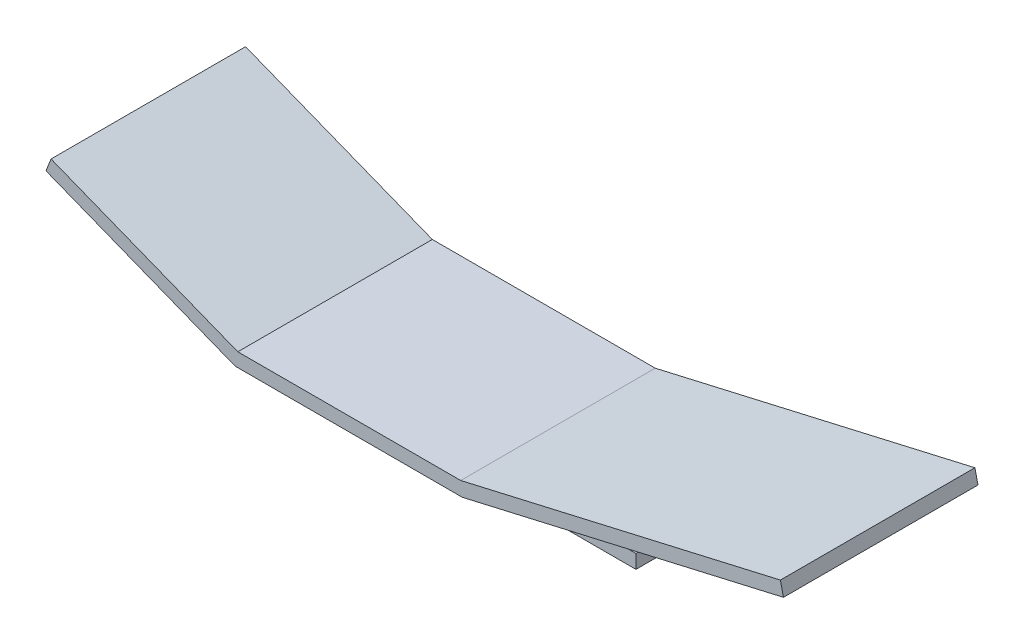
ISO-10303-21;
HEADER;
FILE_DESCRIPTION(('STEP AP214'),'2;1');
FILE_NAME('part.step','',(''),(''),'','','');
FILE_SCHEMA(('AUTOMOTIVE_DESIGN { 1 0 10303 214 1 1 1 1 }'));
ENDSEC;
DATA;
#1=APPLICATION_CONTEXT('core data for automotive mechanical design processes');
#2=APPLICATION_PROTOCOL_DEFINITION('international standard','automotive_design',2000,#1);
#3=PRODUCT_CONTEXT('',#1,'mechanical');
#4=PRODUCT('Part','Part','',(#3));
#5=PRODUCT_RELATED_PRODUCT_CATEGORY('part','',(#4));
#6=PRODUCT_DEFINITION_FORMATION('','',#4);
#7=PRODUCT_DEFINITION_CONTEXT('part definition',#1,'design');
#8=PRODUCT_DEFINITION('design','',#6,#7);
#9=PRODUCT_DEFINITION_SHAPE('','',#8);
#10=(LENGTH_UNIT() NAMED_UNIT(*) SI_UNIT(.MILLI.,.METRE.));
#11=(NAMED_UNIT(*) PLANE_ANGLE_UNIT() SI_UNIT($,.RADIAN.));
#12=(NAMED_UNIT(*) SI_UNIT($,.STERADIAN.) SOLID_ANGLE_UNIT());
#13=UNCERTAINTY_MEASURE_WITH_UNIT(LENGTH_MEASURE(1.E-05),#10,'distance_accuracy_value','');
#14=(GEOMETRIC_REPRESENTATION_CONTEXT(3) GLOBAL_UNCERTAINTY_ASSIGNED_CONTEXT((#13)) GLOBAL_UNIT_ASSIGNED_CONTEXT((#10,
#11,#12)) REPRESENTATION_CONTEXT('',''));
#15=CARTESIAN_POINT('',(0.,0.,0.));
#16=DIRECTION('',(0.,0.,1.));
#17=DIRECTION('',(1.,0.,0.));
#18=AXIS2_PLACEMENT_3D('',#15,#16,#17);
#19=CARTESIAN_POINT('',(-6.23340511781482,956.424051105642,270.));
#20=DIRECTION('',(0.930350718252127,-0.366670889283225,0.));
#21=DIRECTION('',(0.366670889283225,0.930350718252127,0.));
#22=AXIS2_PLACEMENT_3D('',#19,#20,#21);
#23=PLANE('',#22);
#24=DIRECTION('',(-0.366670889283225,-0.930350718252127,0.));
#25=VECTOR('',#24,1.);
#26=CARTESIAN_POINT('',(-6.23340511781482,956.424051105642,30.));
#27=LINE('',#26,#25);
#28=CARTESIAN_POINT('',(0.,972.240013315928,30.));
#29=VERTEX_POINT('',#28);
#30=CARTESIAN_POINT('',(-6.23340511781482,956.424051105642,30.));
#31=VERTEX_POINT('',#30);
#32=EDGE_CURVE('E139',#29,#31,#27,.T.);
#33=ORIENTED_EDGE('',*,*,#32,.T.);
#34=DIRECTION('',(0.,0.,-1.));
#35=VECTOR('',#34,1.);
#36=CARTESIAN_POINT('',(-6.23340511781482,956.424051105642,270.));
#37=LINE('',#36,#35);
#38=CARTESIAN_POINT('',(-6.23340511781482,956.424051105642,270.));
#39=VERTEX_POINT('',#38);
#40=EDGE_CURVE('E12',#39,#31,#37,.T.);
#41=ORIENTED_EDGE('',*,*,#40,.F.);
#42=DIRECTION('',(-0.366670889283225,-0.930350718252127,0.));
#43=VECTOR('',#42,1.);
#44=CARTESIAN_POINT('',(-6.23340511781482,956.424051105642,270.));
#45=LINE('',#44,#43);
#46=CARTESIAN_POINT('',(0.,972.240013315928,270.));
#47=VERTEX_POINT('',#46);
#48=EDGE_CURVE('E153',#47,#39,#45,.T.);
#49=ORIENTED_EDGE('',*,*,#48,.F.);
#50=DIRECTION('',(0.,0.,-1.));
#51=VECTOR('',#50,1.);
#52=CARTESIAN_POINT('',(0.,972.240013315928,270.));
#53=LINE('',#52,#51);
#54=EDGE_CURVE('E135',#47,#29,#53,.T.);
#55=ORIENTED_EDGE('',*,*,#54,.T.);
#56=EDGE_LOOP('',(#33,#41,#49,#55));
#57=FACE_BOUND('',#56,.T.);
#58=ADVANCED_FACE('F43',(#57),#23,.F.);
#59=CARTESIAN_POINT('',(-6.23340511781482,956.424051105642,270.));
#60=DIRECTION('',(0.366670889283225,0.930350718252127,0.));
#61=DIRECTION('',(-0.930350718252127,0.366670889283225,0.));
#62=AXIS2_PLACEMENT_3D('',#59,#60,#61);
#63=PLANE('',#62);
#64=DIRECTION('',(0.930350718252127,-0.366670889283225,0.));
#65=VECTOR('',#64,1.);
#66=CARTESIAN_POINT('',(-6.23340511781482,956.424051105642,30.));
#67=LINE('',#66,#65);
#68=CARTESIAN_POINT('',(227.172021002602,864.434037576239,30.));
#69=VERTEX_POINT('',#68);
#70=EDGE_CURVE('E142',#31,#69,#67,.T.);
#71=ORIENTED_EDGE('',*,*,#70,.T.);
#72=DIRECTION('',(0.,0.,-1.));
#73=VECTOR('',#72,1.);
#74=CARTESIAN_POINT('',(227.172021002602,864.434037576239,270.));
#75=LINE('',#74,#73);
#76=CARTESIAN_POINT('',(227.172021002602,864.434037576239,270.));
#77=VERTEX_POINT('',#76);
#78=EDGE_CURVE('E51',#77,#69,#75,.T.);
#79=ORIENTED_EDGE('',*,*,#78,.F.);
#80=DIRECTION('',(0.930350718252127,-0.366670889283225,0.));
#81=VECTOR('',#80,1.);
#82=CARTESIAN_POINT('',(-6.23340511781482,956.424051105642,270.));
#83=LINE('',#82,#81);
#84=EDGE_CURVE('E102',#39,#77,#83,.T.);
#85=ORIENTED_EDGE('',*,*,#84,.F.);
#86=ORIENTED_EDGE('',*,*,#40,.T.);
#87=EDGE_LOOP('',(#71,#79,#85,#86));
#88=FACE_BOUND('',#87,.T.);
#89=ADVANCED_FACE('F188',(#88),#63,.F.);
#90=CARTESIAN_POINT('',(227.172021002602,864.434037576239,270.));
#91=DIRECTION('',(0.,1.,0.));
#92=DIRECTION('',(0.,0.,1.));
#93=AXIS2_PLACEMENT_3D('',#90,#91,#92);
#94=PLANE('',#93);
#95=DIRECTION('',(1.,0.,0.));
#96=VECTOR('',#95,1.);
#97=CARTESIAN_POINT('',(227.172021002602,864.434037576239,30.));
#98=LINE('',#97,#96);
#99=CARTESIAN_POINT('',(507.332852152899,864.434037576239,30.));
#100=VERTEX_POINT('',#99);
#101=EDGE_CURVE('E144',#69,#100,#98,.T.);
#102=ORIENTED_EDGE('',*,*,#101,.T.);
#103=DIRECTION('',(0.,0.,-1.));
#104=VECTOR('',#103,1.);
#105=CARTESIAN_POINT('',(507.332852152899,864.434037576239,270.));
#106=LINE('',#105,#104);
#107=CARTESIAN_POINT('',(507.332852152899,864.434037576239,270.));
#108=VERTEX_POINT('',#107);
#109=EDGE_CURVE('E160',#108,#100,#106,.T.);
#110=ORIENTED_EDGE('',*,*,#109,.F.);
#111=DIRECTION('',(1.,0.,0.));
#112=VECTOR('',#111,1.);
#113=CARTESIAN_POINT('',(227.172021002602,864.434037576239,270.));
#114=LINE('',#113,#112);
#115=EDGE_CURVE('E168',#77,#108,#114,.T.);
#116=ORIENTED_EDGE('',*,*,#115,.F.);
#117=ORIENTED_EDGE('',*,*,#78,.T.);
#118=EDGE_LOOP('',(#102,#110,#116,#117));
#119=FACE_BOUND('',#118,.T.);
#120=ADVANCED_FACE('F166',(#119),#94,.F.);
#121=CARTESIAN_POINT('',(507.332852152899,864.434037576239,270.));
#122=DIRECTION('',(-0.224359040766347,0.974506552479974,0.));
#123=DIRECTION('',(-0.974506552479974,-0.224359040766347,0.));
#124=AXIS2_PLACEMENT_3D('',#121,#122,#123);
#125=PLANE('',#124);
#126=DIRECTION('',(0.974506552479974,0.224359040766347,0.));
#127=VECTOR('',#126,1.);
#128=CARTESIAN_POINT('',(507.332852152899,864.434037576239,30.));
#129=LINE('',#128,#127);
#130=CARTESIAN_POINT('',(903.632275153964,955.673401923769,30.));
#131=VERTEX_POINT('',#130);
#132=EDGE_CURVE('E146',#100,#131,#129,.T.);
#133=ORIENTED_EDGE('',*,*,#132,.T.);
#134=DIRECTION('',(0.,0.,-1.));
#135=VECTOR('',#134,1.);
#136=CARTESIAN_POINT('',(903.632275153964,955.673401923769,270.));
#137=LINE('',#136,#135);
#138=CARTESIAN_POINT('',(903.632275153964,955.673401923769,270.));
#139=VERTEX_POINT('',#138);
#140=EDGE_CURVE('E157',#139,#131,#137,.T.);
#141=ORIENTED_EDGE('',*,*,#140,.F.);
#142=DIRECTION('',(0.974506552479974,0.224359040766347,0.));
#143=VECTOR('',#142,1.);
#144=CARTESIAN_POINT('',(507.332852152899,864.434037576239,270.));
#145=LINE('',#144,#143);
#146=EDGE_CURVE('E180',#108,#139,#145,.T.);
#147=ORIENTED_EDGE('',*,*,#146,.F.);
#148=ORIENTED_EDGE('',*,*,#109,.T.);
#149=EDGE_LOOP('',(#133,#141,#147,#148));
#150=FACE_BOUND('',#149,.T.);
#151=ADVANCED_FACE('F176',(#150),#125,.F.);
#152=CARTESIAN_POINT('',(903.632275153964,955.673401923769,270.));
#153=DIRECTION('',(-0.974506552479972,-0.224359040766355,0.));
#154=DIRECTION('',(0.224359040766355,-0.974506552479973,0.));
#155=AXIS2_PLACEMENT_3D('',#152,#153,#154);
#156=PLANE('',#155);
#157=DIRECTION('',(-0.224359040766355,0.974506552479972,0.));
#158=VECTOR('',#157,1.);
#159=CARTESIAN_POINT('',(903.632275153964,955.673401923769,30.));
#160=LINE('',#159,#158);
#161=CARTESIAN_POINT('',(899.818171460936,972.240013315928,30.));
#162=VERTEX_POINT('',#161);
#163=EDGE_CURVE('E148',#131,#162,#160,.T.);
#164=ORIENTED_EDGE('',*,*,#163,.T.);
#165=DIRECTION('',(0.,0.,-1.));
#166=VECTOR('',#165,1.);
#167=CARTESIAN_POINT('',(899.818171460936,972.240013315928,270.));
#168=LINE('',#167,#166);
#169=CARTESIAN_POINT('',(899.818171460936,972.240013315928,270.));
#170=VERTEX_POINT('',#169);
#171=EDGE_CURVE('E130',#170,#162,#168,.T.);
#172=ORIENTED_EDGE('',*,*,#171,.F.);
#173=DIRECTION('',(-0.224359040766355,0.974506552479972,0.));
#174=VECTOR('',#173,1.);
#175=CARTESIAN_POINT('',(903.632275153964,955.673401923769,270.));
#176=LINE('',#175,#174);
#177=EDGE_CURVE('E121',#139,#170,#176,.T.);
#178=ORIENTED_EDGE('',*,*,#177,.F.);
#179=ORIENTED_EDGE('',*,*,#140,.T.);
#180=EDGE_LOOP('',(#164,#172,#178,#179));
#181=FACE_BOUND('',#180,.T.);
#182=ADVANCED_FACE('F179',(#181),#156,.F.);
#183=CARTESIAN_POINT('',(505.401177786846,881.434037576239,270.));
#184=DIRECTION('',(0.224359040766347,-0.974506552479974,0.));
#185=DIRECTION('',(0.974506552479974,0.224359040766347,0.));
#186=AXIS2_PLACEMENT_3D('',#183,#184,#185);
#187=PLANE('',#186);
#188=DIRECTION('',(-0.974506552479974,-0.224359040766347,0.));
#189=VECTOR('',#188,1.);
#190=CARTESIAN_POINT('',(505.401177786846,881.434037576239,30.));
#191=LINE('',#190,#189);
#192=CARTESIAN_POINT('',(505.401177786846,881.434037576239,30.));
#193=VERTEX_POINT('',#192);
#194=EDGE_CURVE('E129',#162,#193,#191,.T.);
#195=ORIENTED_EDGE('',*,*,#194,.T.);
#196=DIRECTION('',(0.,0.,-1.));
#197=VECTOR('',#196,1.);
#198=CARTESIAN_POINT('',(505.401177786846,881.434037576239,270.));
#199=LINE('',#198,#197);
#200=CARTESIAN_POINT('',(505.401177786846,881.434037576239,270.));
#201=VERTEX_POINT('',#200);
#202=EDGE_CURVE('E126',#201,#193,#199,.T.);
#203=ORIENTED_EDGE('',*,*,#202,.F.);
#204=DIRECTION('',(-0.974506552479974,-0.224359040766347,0.));
#205=VECTOR('',#204,1.);
#206=CARTESIAN_POINT('',(505.401177786846,881.434037576239,270.));
#207=LINE('',#206,#205);
#208=EDGE_CURVE('E115',#170,#201,#207,.T.);
#209=ORIENTED_EDGE('',*,*,#208,.F.);
#210=ORIENTED_EDGE('',*,*,#171,.T.);
#211=EDGE_LOOP('',(#195,#203,#209,#210));
#212=FACE_BOUND('',#211,.T.);
#213=ADVANCED_FACE('F127',(#212),#187,.F.);
#214=CARTESIAN_POINT('',(230.401177786846,881.434037576239,270.));
#215=DIRECTION('',(0.,-1.,0.));
#216=DIRECTION('',(0.,0.,-1.));
#217=AXIS2_PLACEMENT_3D('',#214,#215,#216);
#218=PLANE('',#217);
#219=DIRECTION('',(-1.,0.,0.));
#220=VECTOR('',#219,1.);
#221=CARTESIAN_POINT('',(230.401177786846,881.434037576239,30.));
#222=LINE('',#221,#220);
#223=CARTESIAN_POINT('',(230.401177786846,881.434037576239,30.));
#224=VERTEX_POINT('',#223);
#225=EDGE_CURVE('E88',#193,#224,#222,.T.);
#226=ORIENTED_EDGE('',*,*,#225,.T.);
#227=DIRECTION('',(0.,0.,-1.));
#228=VECTOR('',#227,1.);
#229=CARTESIAN_POINT('',(230.401177786846,881.434037576239,270.));
#230=LINE('',#229,#228);
#231=CARTESIAN_POINT('',(230.401177786846,881.434037576239,270.));
#232=VERTEX_POINT('',#231);
#233=EDGE_CURVE('E131',#232,#224,#230,.T.);
#234=ORIENTED_EDGE('',*,*,#233,.F.);
#235=DIRECTION('',(-1.,0.,0.));
#236=VECTOR('',#235,1.);
#237=CARTESIAN_POINT('',(230.401177786846,881.434037576239,270.));
#238=LINE('',#237,#236);
#239=EDGE_CURVE('E119',#201,#232,#238,.T.);
#240=ORIENTED_EDGE('',*,*,#239,.F.);
#241=ORIENTED_EDGE('',*,*,#202,.T.);
#242=EDGE_LOOP('',(#226,#234,#240,#241));
#243=FACE_BOUND('',#242,.T.);
#244=ADVANCED_FACE('F133',(#243),#218,.F.);
#245=CARTESIAN_POINT('',(0.,972.240013315928,270.));
#246=DIRECTION('',(-0.366670889283225,-0.930350718252127,0.));
#247=DIRECTION('',(0.930350718252127,-0.366670889283225,0.));
#248=AXIS2_PLACEMENT_3D('',#245,#246,#247);
#249=PLANE('',#248);
#250=DIRECTION('',(-0.930350718252127,0.366670889283225,0.));
#251=VECTOR('',#250,1.);
#252=CARTESIAN_POINT('',(0.,972.240013315928,30.));
#253=LINE('',#252,#251);
#254=EDGE_CURVE('E94',#224,#29,#253,.T.);
#255=ORIENTED_EDGE('',*,*,#254,.T.);
#256=ORIENTED_EDGE('',*,*,#54,.F.);
#257=DIRECTION('',(-0.930350718252127,0.366670889283225,0.));
#258=VECTOR('',#257,1.);
#259=CARTESIAN_POINT('',(0.,972.240013315928,270.));
#260=LINE('',#259,#258);
#261=EDGE_CURVE('E59',#232,#47,#260,.T.);
#262=ORIENTED_EDGE('',*,*,#261,.F.);
#263=ORIENTED_EDGE('',*,*,#233,.T.);
#264=EDGE_LOOP('',(#255,#256,#262,#263));
#265=FACE_BOUND('',#264,.T.);
#266=ADVANCED_FACE('F204',(#265),#249,.F.);
#267=CARTESIAN_POINT('',(0.,0.,270.));
#268=DIRECTION('',(0.,0.,-1.));
#269=DIRECTION('',(-1.,0.,0.));
#270=AXIS2_PLACEMENT_3D('',#267,#268,#269);
#271=PLANE('',#270);
#272=ORIENTED_EDGE('',*,*,#48,.T.);
#273=ORIENTED_EDGE('',*,*,#84,.T.);
#274=ORIENTED_EDGE('',*,*,#115,.T.);
#275=ORIENTED_EDGE('',*,*,#146,.T.);
#276=ORIENTED_EDGE('',*,*,#177,.T.);
#277=ORIENTED_EDGE('',*,*,#208,.T.);
#278=ORIENTED_EDGE('',*,*,#239,.T.);
#279=ORIENTED_EDGE('',*,*,#261,.T.);
#280=EDGE_LOOP('',(#272,#273,#274,#275,#276,#277,#278,#279));
#281=FACE_BOUND('',#280,.T.);
#282=ADVANCED_FACE('F117',(#281),#271,.F.);
#283=CARTESIAN_POINT('',(0.,0.,30.));
#284=DIRECTION('',(0.,0.,-1.));
#285=DIRECTION('',(-1.,0.,0.));
#286=AXIS2_PLACEMENT_3D('',#283,#284,#285);
#287=PLANE('',#286);
#288=ORIENTED_EDGE('',*,*,#32,.F.);
#289=ORIENTED_EDGE('',*,*,#254,.F.);
#290=ORIENTED_EDGE('',*,*,#225,.F.);
#291=ORIENTED_EDGE('',*,*,#194,.F.);
#292=ORIENTED_EDGE('',*,*,#163,.F.);
#293=ORIENTED_EDGE('',*,*,#132,.F.);
#294=ORIENTED_EDGE('',*,*,#101,.F.);
#295=ORIENTED_EDGE('',*,*,#70,.F.);
#296=EDGE_LOOP('',(#288,#289,#290,#291,#292,#293,#294,#295));
#297=FACE_BOUND('',#296,.T.);
#298=ADVANCED_FACE('F172',(#297),#287,.T.);
#299=CLOSED_SHELL('',(#58,#89,#120,#151,#182,#213,#244,#266,#282,#298));
#300=MANIFOLD_SOLID_BREP('B2',#299);
#301=CARTESIAN_POINT('',(-9.03522372891062,701.516670882735,60.));
#302=DIRECTION('',(1.,0.,0.));
#303=DIRECTION('',(0.,1.,0.));
#304=AXIS2_PLACEMENT_3D('',#301,#302,#303);
#305=PLANE('',#304);
#306=DIRECTION('',(0.,-1.,0.));
#307=VECTOR('',#306,1.);
#308=CARTESIAN_POINT('',(-9.03522372891062,701.516670882735,30.));
#309=LINE('',#308,#307);
#310=CARTESIAN_POINT('',(-9.03522372891062,701.516670882735,30.));
#311=VERTEX_POINT('',#310);
#312=CARTESIAN_POINT('',(-9.03522372891062,684.516670882735,30.));
#313=VERTEX_POINT('',#312);
#314=EDGE_CURVE('E334',#311,#313,#309,.T.);
#315=ORIENTED_EDGE('',*,*,#314,.T.);
#316=DIRECTION('',(0.,0.,-1.));
#317=VECTOR('',#316,1.);
#318=CARTESIAN_POINT('',(-9.03522372891062,684.516670882735,60.));
#319=LINE('',#318,#317);
#320=CARTESIAN_POINT('',(-9.03522372891062,684.516670882735,60.));
#321=VERTEX_POINT('',#320);
#322=EDGE_CURVE('E41',#321,#313,#319,.T.);
#323=ORIENTED_EDGE('',*,*,#322,.F.);
#324=DIRECTION('',(0.,-1.,0.));
#325=VECTOR('',#324,1.);
#326=CARTESIAN_POINT('',(-9.03522372891062,701.516670882735,60.));
#327=LINE('',#326,#325);
#328=CARTESIAN_POINT('',(-9.03522372891062,701.516670882735,60.));
#329=VERTEX_POINT('',#328);
#330=EDGE_CURVE('E322',#329,#321,#327,.T.);
#331=ORIENTED_EDGE('',*,*,#330,.F.);
#332=DIRECTION('',(0.,0.,-1.));
#333=VECTOR('',#332,1.);
#334=CARTESIAN_POINT('',(-9.03522372891062,701.516670882735,60.));
#335=LINE('',#334,#333);
#336=EDGE_CURVE('E330',#329,#311,#335,.T.);
#337=ORIENTED_EDGE('',*,*,#336,.T.);
#338=EDGE_LOOP('',(#315,#323,#331,#337));
#339=FACE_BOUND('',#338,.T.);
#340=ADVANCED_FACE('F271',(#339),#305,.F.);
#341=CARTESIAN_POINT('',(-9.03522372891062,684.516670882735,60.));
#342=DIRECTION('',(0.,1.,0.));
#343=DIRECTION('',(0.,0.,1.));
#344=AXIS2_PLACEMENT_3D('',#341,#342,#343);
#345=PLANE('',#344);
#346=DIRECTION('',(1.,0.,0.));
#347=VECTOR('',#346,1.);
#348=CARTESIAN_POINT('',(-9.03522372891062,684.516670882735,30.));
#349=LINE('',#348,#347);
#350=CARTESIAN_POINT('',(511.613856781656,684.516670882735,30.));
#351=VERTEX_POINT('',#350);
#352=EDGE_CURVE('E326',#313,#351,#349,.T.);
#353=ORIENTED_EDGE('',*,*,#352,.T.);
#354=DIRECTION('',(0.,0.,-1.));
#355=VECTOR('',#354,1.);
#356=CARTESIAN_POINT('',(511.613856781656,684.516670882735,60.));
#357=LINE('',#356,#355);
#358=CARTESIAN_POINT('',(511.613856781656,684.516670882735,60.));
#359=VERTEX_POINT('',#358);
#360=EDGE_CURVE('E279',#359,#351,#357,.T.);
#361=ORIENTED_EDGE('',*,*,#360,.F.);
#362=DIRECTION('',(1.,0.,0.));
#363=VECTOR('',#362,1.);
#364=CARTESIAN_POINT('',(-9.03522372891062,684.516670882735,60.));
#365=LINE('',#364,#363);
#366=EDGE_CURVE('E317',#321,#359,#365,.T.);
#367=ORIENTED_EDGE('',*,*,#366,.F.);
#368=ORIENTED_EDGE('',*,*,#322,.T.);
#369=EDGE_LOOP('',(#353,#361,#367,#368));
#370=FACE_BOUND('',#369,.T.);
#371=ADVANCED_FACE('F325',(#370),#345,.F.);
#372=CARTESIAN_POINT('',(511.613856781656,701.516670882735,60.));
#373=DIRECTION('',(-1.,0.,0.));
#374=DIRECTION('',(0.,0.,1.));
#375=AXIS2_PLACEMENT_3D('',#372,#373,#374);
#376=PLANE('',#375);
#377=DIRECTION('',(0.,1.,0.));
#378=VECTOR('',#377,1.);
#379=CARTESIAN_POINT('',(511.613856781656,701.516670882735,30.));
#380=LINE('',#379,#378);
#381=CARTESIAN_POINT('',(511.613856781656,701.516670882735,30.));
#382=VERTEX_POINT('',#381);
#383=EDGE_CURVE('E304',#351,#382,#380,.T.);
#384=ORIENTED_EDGE('',*,*,#383,.T.);
#385=DIRECTION('',(0.,0.,-1.));
#386=VECTOR('',#385,1.);
#387=CARTESIAN_POINT('',(511.613856781656,701.516670882735,60.));
#388=LINE('',#387,#386);
#389=CARTESIAN_POINT('',(511.613856781656,701.516670882735,60.));
#390=VERTEX_POINT('',#389);
#391=EDGE_CURVE('E327',#390,#382,#388,.T.);
#392=ORIENTED_EDGE('',*,*,#391,.F.);
#393=DIRECTION('',(0.,1.,0.));
#394=VECTOR('',#393,1.);
#395=CARTESIAN_POINT('',(511.613856781656,701.516670882735,60.));
#396=LINE('',#395,#394);
#397=EDGE_CURVE('E320',#359,#390,#396,.T.);
#398=ORIENTED_EDGE('',*,*,#397,.F.);
#399=ORIENTED_EDGE('',*,*,#360,.T.);
#400=EDGE_LOOP('',(#384,#392,#398,#399));
#401=FACE_BOUND('',#400,.T.);
#402=ADVANCED_FACE('F328',(#401),#376,.F.);
#403=CARTESIAN_POINT('',(-9.03522372891062,701.516670882735,60.));
#404=DIRECTION('',(0.,-1.,0.));
#405=DIRECTION('',(0.,0.,-1.));
#406=AXIS2_PLACEMENT_3D('',#403,#404,#405);
#407=PLANE('',#406);
#408=DIRECTION('',(-1.,0.,0.));
#409=VECTOR('',#408,1.);
#410=CARTESIAN_POINT('',(-9.03522372891062,701.516670882735,30.));
#411=LINE('',#410,#409);
#412=EDGE_CURVE('E310',#382,#311,#411,.T.);
#413=ORIENTED_EDGE('',*,*,#412,.T.);
#414=ORIENTED_EDGE('',*,*,#336,.F.);
#415=DIRECTION('',(-1.,0.,0.));
#416=VECTOR('',#415,1.);
#417=CARTESIAN_POINT('',(-9.03522372891062,701.516670882735,60.));
#418=LINE('',#417,#416);
#419=EDGE_CURVE('E287',#390,#329,#418,.T.);
#420=ORIENTED_EDGE('',*,*,#419,.F.);
#421=ORIENTED_EDGE('',*,*,#391,.T.);
#422=EDGE_LOOP('',(#413,#414,#420,#421));
#423=FACE_BOUND('',#422,.T.);
#424=ADVANCED_FACE('F341',(#423),#407,.F.);
#425=CARTESIAN_POINT('',(0.,0.,60.));
#426=DIRECTION('',(0.,0.,1.));
#427=DIRECTION('',(1.,0.,0.));
#428=AXIS2_PLACEMENT_3D('',#425,#426,#427);
#429=PLANE('',#428);
#430=ORIENTED_EDGE('',*,*,#330,.T.);
#431=ORIENTED_EDGE('',*,*,#366,.T.);
#432=ORIENTED_EDGE('',*,*,#397,.T.);
#433=ORIENTED_EDGE('',*,*,#419,.T.);
#434=EDGE_LOOP('',(#430,#431,#432,#433));
#435=FACE_BOUND('',#434,.T.);
#436=ADVANCED_FACE('F318',(#435),#429,.T.);
#437=CARTESIAN_POINT('',(0.,0.,30.));
#438=DIRECTION('',(0.,0.,1.));
#439=DIRECTION('',(1.,0.,0.));
#440=AXIS2_PLACEMENT_3D('',#437,#438,#439);
#441=PLANE('',#440);
#442=ORIENTED_EDGE('',*,*,#314,.F.);
#443=ORIENTED_EDGE('',*,*,#412,.F.);
#444=ORIENTED_EDGE('',*,*,#383,.F.);
#445=ORIENTED_EDGE('',*,*,#352,.F.);
#446=EDGE_LOOP('',(#442,#443,#444,#445));
#447=FACE_BOUND('',#446,.T.);
#448=ADVANCED_FACE('F344',(#447),#441,.F.);
#449=CLOSED_SHELL('',(#340,#371,#402,#424,#436,#448));
#450=MANIFOLD_SOLID_BREP('B6',#449);
#451=ADVANCED_BREP_SHAPE_REPRESENTATION('',(#18,#300,#450),#14);
#452=SHAPE_DEFINITION_REPRESENTATION(#9,#451);
ENDSEC;
END-ISO-10303-21;
